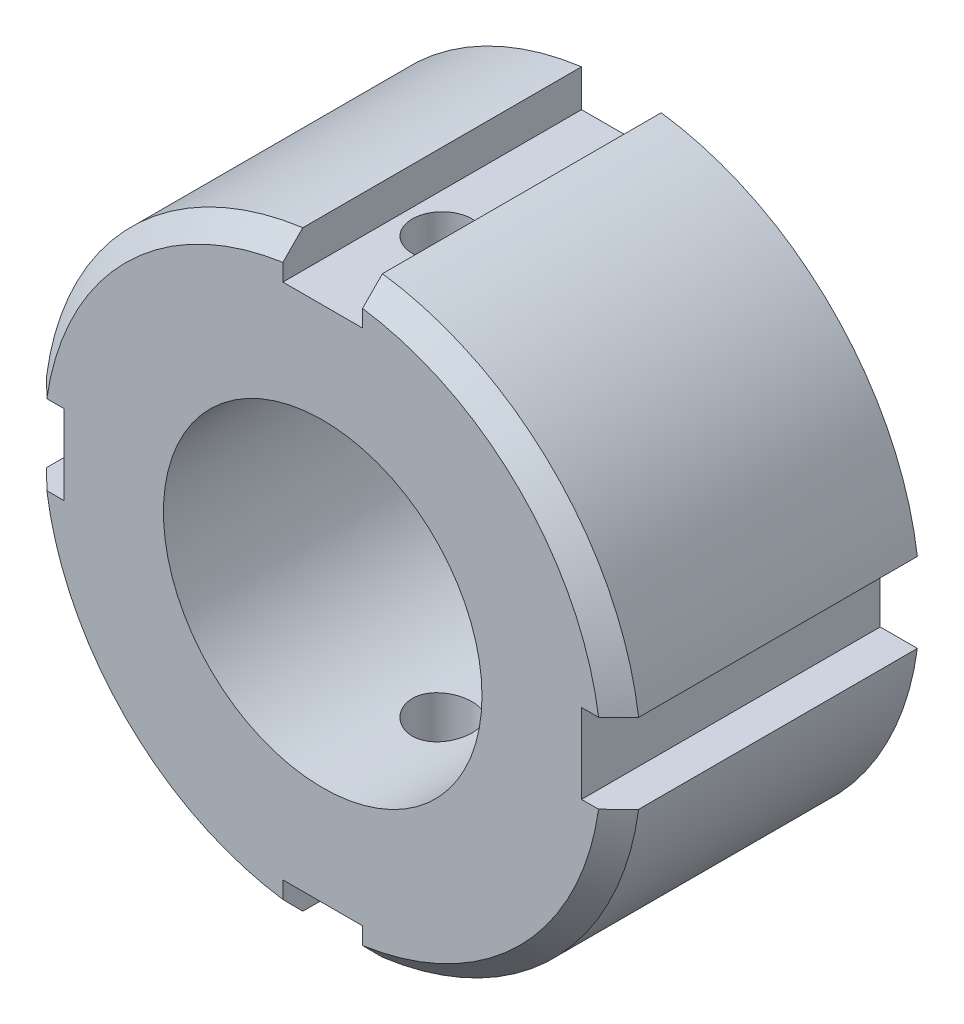
ISO-10303-21;
HEADER;
FILE_DESCRIPTION(('STEP AP214'),'2;1');
FILE_NAME('part.step','',(''),(''),'','','');
FILE_SCHEMA(('AUTOMOTIVE_DESIGN { 1 0 10303 214 1 1 1 1 }'));
ENDSEC;
DATA;
#1=APPLICATION_CONTEXT('core data for automotive mechanical design processes');
#2=APPLICATION_PROTOCOL_DEFINITION('international standard','automotive_design',2000,#1);
#3=PRODUCT_CONTEXT('',#1,'mechanical');
#4=PRODUCT('Part','Part','',(#3));
#5=PRODUCT_RELATED_PRODUCT_CATEGORY('part','',(#4));
#6=PRODUCT_DEFINITION_FORMATION('','',#4);
#7=PRODUCT_DEFINITION_CONTEXT('part definition',#1,'design');
#8=PRODUCT_DEFINITION('design','',#6,#7);
#9=PRODUCT_DEFINITION_SHAPE('','',#8);
#10=(LENGTH_UNIT() NAMED_UNIT(*) SI_UNIT(.MILLI.,.METRE.));
#11=(NAMED_UNIT(*) PLANE_ANGLE_UNIT() SI_UNIT($,.RADIAN.));
#12=(NAMED_UNIT(*) SI_UNIT($,.STERADIAN.) SOLID_ANGLE_UNIT());
#13=UNCERTAINTY_MEASURE_WITH_UNIT(LENGTH_MEASURE(1.E-05),#10,'distance_accuracy_value','');
#14=(GEOMETRIC_REPRESENTATION_CONTEXT(3) GLOBAL_UNCERTAINTY_ASSIGNED_CONTEXT((#13)) GLOBAL_UNIT_ASSIGNED_CONTEXT((#10,
#11,#12)) REPRESENTATION_CONTEXT('',''));
#15=CARTESIAN_POINT('',(0.,0.,0.));
#16=DIRECTION('',(0.,0.,1.));
#17=DIRECTION('',(1.,0.,0.));
#18=AXIS2_PLACEMENT_3D('',#15,#16,#17);
#19=CARTESIAN_POINT('',(0.,0.,7.5));
#20=DIRECTION('',(0.,0.,-1.));
#21=DIRECTION('',(-1.,0.,0.));
#22=AXIS2_PLACEMENT_3D('',#19,#20,#21);
#23=CYLINDRICAL_SURFACE('',#22,15.);
#24=DIRECTION('',(0.,0.,-1.));
#25=VECTOR('',#24,1.);
#26=CARTESIAN_POINT('',(2.,14.8660687473185,7.5));
#27=LINE('',#26,#25);
#28=CARTESIAN_POINT('',(2.,14.8660687473185,6.49999999999998));
#29=VERTEX_POINT('',#28);
#30=CARTESIAN_POINT('',(2.,14.8660687473185,-7.5));
#31=VERTEX_POINT('',#30);
#32=EDGE_CURVE('E217',#29,#31,#27,.T.);
#33=ORIENTED_EDGE('',*,*,#32,.F.);
#34=CARTESIAN_POINT('',(0.,0.,6.49999999999998));
#35=DIRECTION('',(0.,0.,1.));
#36=DIRECTION('',(1.,0.,0.));
#37=AXIS2_PLACEMENT_3D('',#34,#35,#36);
#38=CIRCLE('',#37,15.);
#39=CARTESIAN_POINT('',(14.8660687473185,1.99999999999995,6.49999999999998));
#40=VERTEX_POINT('',#39);
#41=EDGE_CURVE('E345',#29,#40,#38,.F.);
#42=ORIENTED_EDGE('',*,*,#41,.T.);
#43=DIRECTION('',(0.,0.,-1.));
#44=VECTOR('',#43,1.);
#45=CARTESIAN_POINT('',(14.8660687473185,1.99999999999995,7.5));
#46=LINE('',#45,#44);
#47=CARTESIAN_POINT('',(14.8660687473185,1.99999999999995,-7.5));
#48=VERTEX_POINT('',#47);
#49=EDGE_CURVE('E292',#40,#48,#46,.T.);
#50=ORIENTED_EDGE('',*,*,#49,.T.);
#51=CARTESIAN_POINT('',(0.,0.,-7.5));
#52=DIRECTION('',(0.,0.,1.));
#53=DIRECTION('',(1.,0.,0.));
#54=AXIS2_PLACEMENT_3D('',#51,#52,#53);
#55=CIRCLE('',#54,15.);
#56=EDGE_CURVE('E305',#48,#31,#55,.T.);
#57=ORIENTED_EDGE('',*,*,#56,.T.);
#58=EDGE_LOOP('',(#33,#42,#50,#57));
#59=FACE_BOUND('',#58,.T.);
#60=ADVANCED_FACE('F58',(#59),#23,.T.);
#61=DIRECTION('',(0.,0.,-1.));
#62=VECTOR('',#61,1.);
#63=CARTESIAN_POINT('',(-14.8660687473185,2.00000000000015,7.5));
#64=LINE('',#63,#62);
#65=CARTESIAN_POINT('',(-14.8660687473185,2.00000000000015,6.5));
#66=VERTEX_POINT('',#65);
#67=CARTESIAN_POINT('',(-14.8660687473185,2.00000000000015,-7.5));
#68=VERTEX_POINT('',#67);
#69=EDGE_CURVE('E256',#66,#68,#64,.T.);
#70=ORIENTED_EDGE('',*,*,#69,.F.);
#71=CARTESIAN_POINT('',(0.,0.,6.5));
#72=DIRECTION('',(0.,0.,1.));
#73=DIRECTION('',(1.,0.,0.));
#74=AXIS2_PLACEMENT_3D('',#71,#72,#73);
#75=CIRCLE('',#74,15.);
#76=CARTESIAN_POINT('',(-2.,14.8660687473185,6.49999999999999));
#77=VERTEX_POINT('',#76);
#78=EDGE_CURVE('E68',#66,#77,#75,.F.);
#79=ORIENTED_EDGE('',*,*,#78,.T.);
#80=DIRECTION('',(0.,0.,-1.));
#81=VECTOR('',#80,1.);
#82=CARTESIAN_POINT('',(-2.,14.8660687473185,7.5));
#83=LINE('',#82,#81);
#84=CARTESIAN_POINT('',(-2.,14.8660687473185,-7.5));
#85=VERTEX_POINT('',#84);
#86=EDGE_CURVE('E236',#77,#85,#83,.T.);
#87=ORIENTED_EDGE('',*,*,#86,.T.);
#88=EDGE_CURVE('E309',#85,#68,#55,.T.);
#89=ORIENTED_EDGE('',*,*,#88,.T.);
#90=EDGE_LOOP('',(#70,#79,#87,#89));
#91=FACE_BOUND('',#90,.T.);
#92=ADVANCED_FACE('F411',(#91),#23,.T.);
#93=CARTESIAN_POINT('',(0.,0.,7.5));
#94=DIRECTION('',(0.,0.,1.));
#95=DIRECTION('',(1.,0.,0.));
#96=AXIS2_PLACEMENT_3D('',#93,#94,#95);
#97=PLANE('',#96);
#98=DIRECTION('',(-1.,0.,0.));
#99=VECTOR('',#98,1.);
#100=CARTESIAN_POINT('',(0.,2.,7.5));
#101=LINE('',#100,#99);
#102=CARTESIAN_POINT('',(13.856406460551,1.99999999999995,7.5));
#103=VERTEX_POINT('',#102);
#104=CARTESIAN_POINT('',(13.,1.99999999999995,7.5));
#105=VERTEX_POINT('',#104);
#106=EDGE_CURVE('E285',#103,#105,#101,.T.);
#107=ORIENTED_EDGE('',*,*,#106,.F.);
#108=CARTESIAN_POINT('',(0.,0.,7.5));
#109=DIRECTION('',(0.,0.,1.));
#110=DIRECTION('',(1.,0.,0.));
#111=AXIS2_PLACEMENT_3D('',#108,#109,#110);
#112=CIRCLE('',#111,14.);
#113=CARTESIAN_POINT('',(2.,13.856406460551,7.5));
#114=VERTEX_POINT('',#113);
#115=EDGE_CURVE('E204',#103,#114,#112,.T.);
#116=ORIENTED_EDGE('',*,*,#115,.T.);
#117=DIRECTION('',(0.,-1.,0.));
#118=VECTOR('',#117,1.);
#119=CARTESIAN_POINT('',(2.,17.,7.5));
#120=LINE('',#119,#118);
#121=CARTESIAN_POINT('',(2.,13.,7.5));
#122=VERTEX_POINT('',#121);
#123=EDGE_CURVE('E196',#114,#122,#120,.T.);
#124=ORIENTED_EDGE('',*,*,#123,.T.);
#125=DIRECTION('',(1.,0.,0.));
#126=VECTOR('',#125,1.);
#127=CARTESIAN_POINT('',(-2.,13.,7.5));
#128=LINE('',#127,#126);
#129=CARTESIAN_POINT('',(-2.,13.,7.5));
#130=VERTEX_POINT('',#129);
#131=EDGE_CURVE('E202',#130,#122,#128,.T.);
#132=ORIENTED_EDGE('',*,*,#131,.F.);
#133=DIRECTION('',(0.,-1.,0.));
#134=VECTOR('',#133,1.);
#135=CARTESIAN_POINT('',(-2.,0.,7.5));
#136=LINE('',#135,#134);
#137=CARTESIAN_POINT('',(-2.,13.856406460551,7.5));
#138=VERTEX_POINT('',#137);
#139=EDGE_CURVE('E222',#138,#130,#136,.T.);
#140=ORIENTED_EDGE('',*,*,#139,.F.);
#141=CARTESIAN_POINT('',(0.,0.,7.5));
#142=DIRECTION('',(0.,0.,1.));
#143=DIRECTION('',(1.,0.,0.));
#144=AXIS2_PLACEMENT_3D('',#141,#142,#143);
#145=CIRCLE('',#144,14.);
#146=CARTESIAN_POINT('',(-13.856406460551,2.00000000000014,7.5));
#147=VERTEX_POINT('',#146);
#148=EDGE_CURVE('E328',#138,#147,#145,.T.);
#149=ORIENTED_EDGE('',*,*,#148,.T.);
#150=DIRECTION('',(1.,0.,0.));
#151=VECTOR('',#150,1.);
#152=CARTESIAN_POINT('',(0.,2.,7.5));
#153=LINE('',#152,#151);
#154=CARTESIAN_POINT('',(-13.,2.00000000000014,7.5));
#155=VERTEX_POINT('',#154);
#156=EDGE_CURVE('E250',#147,#155,#153,.T.);
#157=ORIENTED_EDGE('',*,*,#156,.T.);
#158=DIRECTION('',(0.,1.,0.));
#159=VECTOR('',#158,1.);
#160=CARTESIAN_POINT('',(-13.,1.35308431126191E-13,7.5));
#161=LINE('',#160,#159);
#162=CARTESIAN_POINT('',(-13.,-1.99999999999987,7.5));
#163=VERTEX_POINT('',#162);
#164=EDGE_CURVE('E245',#163,#155,#161,.T.);
#165=ORIENTED_EDGE('',*,*,#164,.F.);
#166=DIRECTION('',(1.,0.,0.));
#167=VECTOR('',#166,1.);
#168=CARTESIAN_POINT('',(0.,-2.,7.5));
#169=LINE('',#168,#167);
#170=CARTESIAN_POINT('',(-13.856406460551,-1.99999999999986,7.5));
#171=VERTEX_POINT('',#170);
#172=EDGE_CURVE('E248',#171,#163,#169,.T.);
#173=ORIENTED_EDGE('',*,*,#172,.F.);
#174=CARTESIAN_POINT('',(0.,0.,7.5));
#175=DIRECTION('',(0.,0.,1.));
#176=DIRECTION('',(1.,0.,0.));
#177=AXIS2_PLACEMENT_3D('',#174,#175,#176);
#178=CIRCLE('',#177,14.);
#179=CARTESIAN_POINT('',(-2.0000000000001,-13.856406460551,7.5));
#180=VERTEX_POINT('',#179);
#181=EDGE_CURVE('E331',#171,#180,#178,.T.);
#182=ORIENTED_EDGE('',*,*,#181,.T.);
#183=DIRECTION('',(0.,1.,0.));
#184=VECTOR('',#183,1.);
#185=CARTESIAN_POINT('',(-2.,0.,7.5));
#186=LINE('',#185,#184);
#187=CARTESIAN_POINT('',(-2.00000000000009,-13.,7.5));
#188=VERTEX_POINT('',#187);
#189=EDGE_CURVE('E270',#180,#188,#186,.T.);
#190=ORIENTED_EDGE('',*,*,#189,.T.);
#191=DIRECTION('',(-1.,0.,0.));
#192=VECTOR('',#191,1.);
#193=CARTESIAN_POINT('',(0.,-13.,7.5));
#194=LINE('',#193,#192);
#195=CARTESIAN_POINT('',(1.99999999999991,-13.,7.5));
#196=VERTEX_POINT('',#195);
#197=EDGE_CURVE('E265',#196,#188,#194,.T.);
#198=ORIENTED_EDGE('',*,*,#197,.F.);
#199=DIRECTION('',(0.,1.,0.));
#200=VECTOR('',#199,1.);
#201=CARTESIAN_POINT('',(2.,0.,7.5));
#202=LINE('',#201,#200);
#203=CARTESIAN_POINT('',(1.9999999999999,-13.856406460551,7.5));
#204=VERTEX_POINT('',#203);
#205=EDGE_CURVE('E268',#204,#196,#202,.T.);
#206=ORIENTED_EDGE('',*,*,#205,.F.);
#207=CARTESIAN_POINT('',(0.,0.,7.5));
#208=DIRECTION('',(0.,0.,1.));
#209=DIRECTION('',(1.,0.,0.));
#210=AXIS2_PLACEMENT_3D('',#207,#208,#209);
#211=CIRCLE('',#210,14.);
#212=CARTESIAN_POINT('',(13.856406460551,-2.00000000000005,7.5));
#213=VERTEX_POINT('',#212);
#214=EDGE_CURVE('E334',#204,#213,#211,.T.);
#215=ORIENTED_EDGE('',*,*,#214,.T.);
#216=DIRECTION('',(-1.,0.,0.));
#217=VECTOR('',#216,1.);
#218=CARTESIAN_POINT('',(0.,-2.,7.5));
#219=LINE('',#218,#217);
#220=CARTESIAN_POINT('',(13.,-2.00000000000005,7.5));
#221=VERTEX_POINT('',#220);
#222=EDGE_CURVE('E278',#213,#221,#219,.T.);
#223=ORIENTED_EDGE('',*,*,#222,.T.);
#224=DIRECTION('',(0.,-1.,0.));
#225=VECTOR('',#224,1.);
#226=CARTESIAN_POINT('',(13.,0.,7.5));
#227=LINE('',#226,#225);
#228=EDGE_CURVE('E283',#105,#221,#227,.T.);
#229=ORIENTED_EDGE('',*,*,#228,.F.);
#230=EDGE_LOOP('',(#107,#116,#124,#132,#140,#149,#157,#165,#173,#182,#190,#198,#206,#215,#223,#229));
#231=FACE_BOUND('',#230,.T.);
#232=CARTESIAN_POINT('',(0.,0.,7.5));
#233=DIRECTION('',(0.,0.,1.));
#234=DIRECTION('',(1.,0.,0.));
#235=AXIS2_PLACEMENT_3D('',#232,#233,#234);
#236=CIRCLE('',#235,8.);
#237=CARTESIAN_POINT('',(8.,0.,7.5));
#238=VERTEX_POINT('',#237);
#239=EDGE_CURVE('E298',#238,#238,#236,.T.);
#240=ORIENTED_EDGE('',*,*,#239,.F.);
#241=EDGE_LOOP('',(#240));
#242=FACE_BOUND('',#241,.T.);
#243=ADVANCED_FACE('F199',(#231,#242),#97,.T.);
#244=CARTESIAN_POINT('',(0.,0.,-7.5));
#245=DIRECTION('',(0.,0.,1.));
#246=DIRECTION('',(1.,0.,0.));
#247=AXIS2_PLACEMENT_3D('',#244,#245,#246);
#248=PLANE('',#247);
#249=CARTESIAN_POINT('',(0.,0.,-7.5));
#250=DIRECTION('',(0.,0.,1.));
#251=DIRECTION('',(1.,0.,0.));
#252=AXIS2_PLACEMENT_3D('',#249,#250,#251);
#253=CIRCLE('',#252,8.);
#254=CARTESIAN_POINT('',(8.,0.,-7.5));
#255=VERTEX_POINT('',#254);
#256=EDGE_CURVE('E299',#255,#255,#253,.T.);
#257=ORIENTED_EDGE('',*,*,#256,.T.);
#258=EDGE_LOOP('',(#257));
#259=FACE_BOUND('',#258,.T.);
#260=ORIENTED_EDGE('',*,*,#88,.F.);
#261=DIRECTION('',(0.,-1.,0.));
#262=VECTOR('',#261,1.);
#263=CARTESIAN_POINT('',(-2.,0.,-7.5));
#264=LINE('',#263,#262);
#265=CARTESIAN_POINT('',(-2.,13.,-7.5));
#266=VERTEX_POINT('',#265);
#267=EDGE_CURVE('E325',#85,#266,#264,.T.);
#268=ORIENTED_EDGE('',*,*,#267,.T.);
#269=DIRECTION('',(1.,0.,0.));
#270=VECTOR('',#269,1.);
#271=CARTESIAN_POINT('',(-2.,13.,-7.5));
#272=LINE('',#271,#270);
#273=CARTESIAN_POINT('',(2.,13.,-7.5));
#274=VERTEX_POINT('',#273);
#275=EDGE_CURVE('E207',#266,#274,#272,.T.);
#276=ORIENTED_EDGE('',*,*,#275,.T.);
#277=DIRECTION('',(0.,-1.,0.));
#278=VECTOR('',#277,1.);
#279=CARTESIAN_POINT('',(2.,0.,-7.5));
#280=LINE('',#279,#278);
#281=EDGE_CURVE('E221',#31,#274,#280,.T.);
#282=ORIENTED_EDGE('',*,*,#281,.F.);
#283=ORIENTED_EDGE('',*,*,#56,.F.);
#284=DIRECTION('',(-1.,0.,0.));
#285=VECTOR('',#284,1.);
#286=CARTESIAN_POINT('',(0.,2.,-7.5));
#287=LINE('',#286,#285);
#288=CARTESIAN_POINT('',(13.,1.99999999999995,-7.5));
#289=VERTEX_POINT('',#288);
#290=EDGE_CURVE('E308',#48,#289,#287,.T.);
#291=ORIENTED_EDGE('',*,*,#290,.T.);
#292=DIRECTION('',(0.,-1.,0.));
#293=VECTOR('',#292,1.);
#294=CARTESIAN_POINT('',(13.,0.,-7.5));
#295=LINE('',#294,#293);
#296=CARTESIAN_POINT('',(13.,-2.00000000000005,-7.5));
#297=VERTEX_POINT('',#296);
#298=EDGE_CURVE('E279',#289,#297,#295,.T.);
#299=ORIENTED_EDGE('',*,*,#298,.T.);
#300=DIRECTION('',(-1.,0.,0.));
#301=VECTOR('',#300,1.);
#302=CARTESIAN_POINT('',(0.,-2.,-7.5));
#303=LINE('',#302,#301);
#304=CARTESIAN_POINT('',(14.8660687473185,-2.00000000000005,-7.5));
#305=VERTEX_POINT('',#304);
#306=EDGE_CURVE('E312',#305,#297,#303,.T.);
#307=ORIENTED_EDGE('',*,*,#306,.F.);
#308=CARTESIAN_POINT('',(1.9999999999999,-14.8660687473185,-7.5));
#309=VERTEX_POINT('',#308);
#310=EDGE_CURVE('E302',#309,#305,#55,.T.);
#311=ORIENTED_EDGE('',*,*,#310,.F.);
#312=DIRECTION('',(0.,1.,0.));
#313=VECTOR('',#312,1.);
#314=CARTESIAN_POINT('',(2.,0.,-7.5));
#315=LINE('',#314,#313);
#316=CARTESIAN_POINT('',(1.99999999999991,-13.,-7.5));
#317=VERTEX_POINT('',#316);
#318=EDGE_CURVE('E314',#309,#317,#315,.T.);
#319=ORIENTED_EDGE('',*,*,#318,.T.);
#320=DIRECTION('',(-1.,0.,0.));
#321=VECTOR('',#320,1.);
#322=CARTESIAN_POINT('',(0.,-13.,-7.5));
#323=LINE('',#322,#321);
#324=CARTESIAN_POINT('',(-2.00000000000009,-13.,-7.5));
#325=VERTEX_POINT('',#324);
#326=EDGE_CURVE('E262',#317,#325,#323,.T.);
#327=ORIENTED_EDGE('',*,*,#326,.T.);
#328=DIRECTION('',(0.,1.,0.));
#329=VECTOR('',#328,1.);
#330=CARTESIAN_POINT('',(-2.,0.,-7.5));
#331=LINE('',#330,#329);
#332=CARTESIAN_POINT('',(-2.00000000000011,-14.8660687473185,-7.5));
#333=VERTEX_POINT('',#332);
#334=EDGE_CURVE('E317',#333,#325,#331,.T.);
#335=ORIENTED_EDGE('',*,*,#334,.F.);
#336=CARTESIAN_POINT('',(-14.8660687473185,-1.99999999999985,-7.5));
#337=VERTEX_POINT('',#336);
#338=EDGE_CURVE('E483',#337,#333,#55,.T.);
#339=ORIENTED_EDGE('',*,*,#338,.F.);
#340=DIRECTION('',(1.,0.,0.));
#341=VECTOR('',#340,1.);
#342=CARTESIAN_POINT('',(0.,-2.,-7.5));
#343=LINE('',#342,#341);
#344=CARTESIAN_POINT('',(-13.,-1.99999999999987,-7.5));
#345=VERTEX_POINT('',#344);
#346=EDGE_CURVE('E319',#337,#345,#343,.T.);
#347=ORIENTED_EDGE('',*,*,#346,.T.);
#348=DIRECTION('',(0.,1.,0.));
#349=VECTOR('',#348,1.);
#350=CARTESIAN_POINT('',(-13.,1.35308431126191E-13,-7.5));
#351=LINE('',#350,#349);
#352=CARTESIAN_POINT('',(-13.,2.00000000000014,-7.5));
#353=VERTEX_POINT('',#352);
#354=EDGE_CURVE('E242',#345,#353,#351,.T.);
#355=ORIENTED_EDGE('',*,*,#354,.T.);
#356=DIRECTION('',(1.,0.,0.));
#357=VECTOR('',#356,1.);
#358=CARTESIAN_POINT('',(0.,2.,-7.5));
#359=LINE('',#358,#357);
#360=EDGE_CURVE('E322',#68,#353,#359,.T.);
#361=ORIENTED_EDGE('',*,*,#360,.F.);
#362=EDGE_LOOP('',(#260,#268,#276,#282,#283,#291,#299,#307,#311,#319,#327,#335,#339,#347,#355,#361));
#363=FACE_BOUND('',#362,.T.);
#364=ADVANCED_FACE('F424',(#259,#363),#248,.F.);
#365=DIRECTION('',(0.,0.,-1.));
#366=VECTOR('',#365,1.);
#367=CARTESIAN_POINT('',(-2.00000000000011,-14.8660687473185,7.5));
#368=LINE('',#367,#366);
#369=CARTESIAN_POINT('',(-2.00000000000011,-14.8660687473185,6.5));
#370=VERTEX_POINT('',#369);
#371=EDGE_CURVE('E276',#370,#333,#368,.T.);
#372=ORIENTED_EDGE('',*,*,#371,.F.);
#373=CARTESIAN_POINT('',(0.,0.,6.5));
#374=DIRECTION('',(0.,0.,1.));
#375=DIRECTION('',(1.,0.,0.));
#376=AXIS2_PLACEMENT_3D('',#373,#374,#375);
#377=CIRCLE('',#376,15.);
#378=CARTESIAN_POINT('',(-14.8660687473185,-1.99999999999985,6.5));
#379=VERTEX_POINT('',#378);
#380=EDGE_CURVE('E498',#370,#379,#377,.F.);
#381=ORIENTED_EDGE('',*,*,#380,.T.);
#382=DIRECTION('',(0.,0.,-1.));
#383=VECTOR('',#382,1.);
#384=CARTESIAN_POINT('',(-14.8660687473185,-1.99999999999985,7.5));
#385=LINE('',#384,#383);
#386=EDGE_CURVE('E252',#379,#337,#385,.T.);
#387=ORIENTED_EDGE('',*,*,#386,.T.);
#388=ORIENTED_EDGE('',*,*,#338,.T.);
#389=EDGE_LOOP('',(#372,#381,#387,#388));
#390=FACE_BOUND('',#389,.T.);
#391=ADVANCED_FACE('F416',(#390),#23,.T.);
#392=DIRECTION('',(0.,0.,-1.));
#393=VECTOR('',#392,1.);
#394=CARTESIAN_POINT('',(14.8660687473185,-2.00000000000005,7.5));
#395=LINE('',#394,#393);
#396=CARTESIAN_POINT('',(14.8660687473185,-2.00000000000005,6.5));
#397=VERTEX_POINT('',#396);
#398=EDGE_CURVE('E296',#397,#305,#395,.T.);
#399=ORIENTED_EDGE('',*,*,#398,.F.);
#400=CARTESIAN_POINT('',(0.,0.,6.5));
#401=DIRECTION('',(0.,0.,1.));
#402=DIRECTION('',(1.,0.,0.));
#403=AXIS2_PLACEMENT_3D('',#400,#401,#402);
#404=CIRCLE('',#403,15.);
#405=CARTESIAN_POINT('',(1.9999999999999,-14.8660687473185,6.5));
#406=VERTEX_POINT('',#405);
#407=EDGE_CURVE('E429',#397,#406,#404,.F.);
#408=ORIENTED_EDGE('',*,*,#407,.T.);
#409=DIRECTION('',(0.,0.,-1.));
#410=VECTOR('',#409,1.);
#411=CARTESIAN_POINT('',(1.9999999999999,-14.8660687473185,7.5));
#412=LINE('',#411,#410);
#413=EDGE_CURVE('E272',#406,#309,#412,.T.);
#414=ORIENTED_EDGE('',*,*,#413,.T.);
#415=ORIENTED_EDGE('',*,*,#310,.T.);
#416=EDGE_LOOP('',(#399,#408,#414,#415));
#417=FACE_BOUND('',#416,.T.);
#418=ADVANCED_FACE('F356',(#417),#23,.T.);
#419=CARTESIAN_POINT('',(0.,0.,-7.5));
#420=DIRECTION('',(0.,0.,1.));
#421=DIRECTION('',(1.,0.,0.));
#422=AXIS2_PLACEMENT_3D('',#419,#420,#421);
#423=CYLINDRICAL_SURFACE('',#422,8.);
#424=CARTESIAN_POINT('',(1.50000000000006,7.85811682275085,1.5));
#425=CARTESIAN_POINT('',(1.49999679883251,7.85811843793492,1.41654279198826));
#426=CARTESIAN_POINT('',(1.49301126348941,7.85946079760265,1.33304405178161));
#427=CARTESIAN_POINT('',(1.46527253251811,7.86467851014363,1.16840103841809));
#428=CARTESIAN_POINT('',(1.44450765768482,7.86855601173204,1.08725882357252));
#429=CARTESIAN_POINT('',(1.38987035617793,7.87838976464884,0.929734928629124));
#430=CARTESIAN_POINT('',(1.3560101395438,7.88434407905996,0.853348890692711));
#431=CARTESIAN_POINT('',(1.27617565760371,7.89765826320958,0.707346440713187));
#432=CARTESIAN_POINT('',(1.23020233759199,7.90501802325621,0.637729500996698));
#433=CARTESIAN_POINT('',(1.12683678942628,7.92041614838944,0.506369800800867));
#434=CARTESIAN_POINT('',(1.06932292933097,7.92846116625678,0.444723516528269));
#435=CARTESIAN_POINT('',(0.944771778803607,7.94426457664033,0.331895610400436));
#436=CARTESIAN_POINT('',(0.877733863625,7.95202295031152,0.280714675575205));
#437=CARTESIAN_POINT('',(0.735403894570218,7.96645017828404,0.189900623399484));
#438=CARTESIAN_POINT('',(0.660052840033921,7.97311028052362,0.150358466480578));
#439=CARTESIAN_POINT('',(0.503631283250818,7.9845160863293,0.0845304577264669));
#440=CARTESIAN_POINT('',(0.422561251859562,7.98926194728334,0.0582435160097801));
#441=CARTESIAN_POINT('',(0.258002746187472,7.99625755123778,0.0199704513888662));
#442=CARTESIAN_POINT('',(0.174553323244913,7.99853565976327,0.00782169407731461));
#443=CARTESIAN_POINT('',(0.00677167603543945,8.00043684615594,-0.00233688770040133));
#444=CARTESIAN_POINT('',(-0.0775604724476139,8.00006015010697,-0.000347916139057801));
#445=CARTESIAN_POINT('',(-0.24359835789934,7.99671633763241,0.0175877711471509));
#446=CARTESIAN_POINT('',(-0.325323760451413,7.99378172247214,0.0333593694300106));
#447=CARTESIAN_POINT('',(-0.484947165715419,7.98568826333562,0.0781356493952366));
#448=CARTESIAN_POINT('',(-0.562845028826484,7.98052933829966,0.107140813345804));
#449=CARTESIAN_POINT('',(-0.713110065751465,7.9685126029734,0.1777277310583));
#450=CARTESIAN_POINT('',(-0.785443571838477,7.96164537590826,0.219379487912497));
#451=CARTESIAN_POINT('',(-0.922159977214582,7.94697147542851,0.314025669077153));
#452=CARTESIAN_POINT('',(-0.986542066910729,7.93916470651165,0.367021246887581));
#453=CARTESIAN_POINT('',(-1.10656561896898,7.92333513680567,0.483815702983531));
#454=CARTESIAN_POINT('',(-1.16205790757036,7.91531085901622,0.547767783902073));
#455=CARTESIAN_POINT('',(-1.26155171851255,7.90006508924621,0.684149531278624));
#456=CARTESIAN_POINT('',(-1.30555307271177,7.89284360901352,0.756579321764634));
#457=CARTESIAN_POINT('',(-1.38085852224472,7.88001893307122,0.90805827070266));
#458=CARTESIAN_POINT('',(-1.41214093645416,7.87441850530262,0.987118457190644));
#459=CARTESIAN_POINT('',(-1.46093656975051,7.8655124239669,1.1495011841232));
#460=CARTESIAN_POINT('',(-1.47845134901103,7.86220651038621,1.23282324046478));
#461=CARTESIAN_POINT('',(-1.49899672649734,7.85831520301006,1.40001932885588));
#462=CARTESIAN_POINT('',(-1.50224164285853,7.85768955816138,1.48386611556551));
#463=CARTESIAN_POINT('',(-1.49472968881719,7.85912191420841,1.65090345508715));
#464=CARTESIAN_POINT('',(-1.48397351086428,7.86117978238612,1.73409404014808));
#465=CARTESIAN_POINT('',(-1.44894868195877,7.86770980063206,1.89675290305439));
#466=CARTESIAN_POINT('',(-1.42479238583984,7.87216186690879,1.97624625262489));
#467=CARTESIAN_POINT('',(-1.36377224379054,7.88296134156619,2.13005718973016));
#468=CARTESIAN_POINT('',(-1.32690746128789,7.88930888963282,2.20437439531533));
#469=CARTESIAN_POINT('',(-1.24102353119654,7.90327577863686,2.34666761904317));
#470=CARTESIAN_POINT('',(-1.19186899639615,7.91090895425316,2.41456053786607));
#471=CARTESIAN_POINT('',(-1.08298344344241,7.92654811368101,2.54121204021433));
#472=CARTESIAN_POINT('',(-1.02325147433078,7.93455413096494,2.59996980155577));
#473=CARTESIAN_POINT('',(-0.893949417870329,7.95016624005946,2.70748376353413));
#474=CARTESIAN_POINT('',(-0.824258534095834,7.95776555833306,2.75609582660597));
#475=CARTESIAN_POINT('',(-0.677574523040084,7.97159404810351,2.84092120617766));
#476=CARTESIAN_POINT('',(-0.600581677038472,7.97782327234725,2.87713500002501));
#477=CARTESIAN_POINT('',(-0.441877541578628,7.98818057995848,2.93592009786408));
#478=CARTESIAN_POINT('',(-0.360193213078931,7.99231954730142,2.95856218756141));
#479=CARTESIAN_POINT('',(-0.194096227381514,7.99807642083745,2.98978704828989));
#480=CARTESIAN_POINT('',(-0.109683858215794,7.99969459229933,2.99837129866271));
#481=CARTESIAN_POINT('',(0.0580907602505658,8.00022227515441,3.00118530151844));
#482=CARTESIAN_POINT('',(0.141449307066325,7.99917286625032,2.99563275312953));
#483=CARTESIAN_POINT('',(0.306023369279256,7.99456866611702,2.97080757223156));
#484=CARTESIAN_POINT('',(0.387238905213746,7.99101389890671,2.95153507125579));
#485=CARTESIAN_POINT('',(0.545106475595541,7.98179837978045,2.89990879261628));
#486=CARTESIAN_POINT('',(0.62176631931828,7.97614135981575,2.86757818711899));
#487=CARTESIAN_POINT('',(0.76860563131675,7.9633337206877,2.79077954634482));
#488=CARTESIAN_POINT('',(0.838784665003327,7.95618300146482,2.74631069789335));
#489=CARTESIAN_POINT('',(0.971755027780063,7.9410477985994,2.64574854555768));
#490=CARTESIAN_POINT('',(1.03442623539059,7.93305284591271,2.58949796613829));
#491=CARTESIAN_POINT('',(1.14951536065491,7.91719633538832,2.46729543750729));
#492=CARTESIAN_POINT('',(1.20193086324786,7.90933480936764,2.40134120962628));
#493=CARTESIAN_POINT('',(1.2954763394539,7.89455577425925,2.26087354529666));
#494=CARTESIAN_POINT('',(1.33649740531877,7.88764767280728,2.18628656033236));
#495=CARTESIAN_POINT('',(1.40536132423422,7.87567084650032,2.03117421002026));
#496=CARTESIAN_POINT('',(1.43321661638918,7.87060038649115,1.95065453341062));
#497=CARTESIAN_POINT('',(1.46929726596181,7.86393016292124,1.80824771193409));
#498=CARTESIAN_POINT('',(1.48079105739856,7.86176310717931,1.74719427623805));
#499=CARTESIAN_POINT('',(1.4961435107622,7.85885585595503,1.62410153157968));
#500=CARTESIAN_POINT('',(1.50000238052133,7.85811562163282,1.56206224949967));
#501=CARTESIAN_POINT('',(1.50000000000006,7.85811682275085,1.5));
#502=B_SPLINE_CURVE_WITH_KNOTS('',3,(#424,#425,#426,#427,#428,#429,#430,#431,#432,#433,#434,
#435,#436,#437,#438,#439,#440,#441,#442,#443,#444,#445,#446,#447,#448,#449,#450,#451,#452,#453,
#454,#455,#456,#457,#458,#459,#460,#461,#462,#463,#464,#465,#466,#467,#468,#469,#470,#471,#472,
#473,#474,#475,#476,#477,#478,#479,#480,#481,#482,#483,#484,#485,#486,#487,#488,#489,#490,#491,
#492,#493,#494,#495,#496,#497,#498,#499,#500,#501),.UNSPECIFIED.,.T.,.F.,(4,2,2,2,2,2,2,2,2,2,2,
2,2,2,2,2,2,2,2,2,2,2,2,2,2,2,2,2,2,2,2,2,2,2,2,2,2,2,4),(0.,0.250144505793187,
0.500501302380393,0.750625227978433,1.00072963993908,1.25362335698691,1.50653367069315,
1.76137104348047,2.0161874593964,2.26804275460261,2.51987660200648,2.76855650598725,
3.01724547328425,3.26733691984219,3.51745380911785,3.77140614764064,4.025362201924,
4.27974936118266,4.53410768866488,4.78463248587075,5.03514489338718,5.28358792315368,
5.53204926624317,5.78337862654144,6.03473059394677,6.28944125495871,6.54414210821705,
6.79750269418683,7.0508366166733,7.30029300570138,7.54974700322167,7.79876026530358,
8.0477902135711,8.30038464008745,8.55303847730765,8.80803001818118,9.06278015749119,
9.24880307527214,9.43482092920425),.UNSPECIFIED.);
#503=CARTESIAN_POINT('',(1.50000000000006,7.85811682275085,1.5));
#504=VERTEX_POINT('',#503);
#505=EDGE_CURVE('E227',#504,#504,#502,.T.);
#506=ORIENTED_EDGE('',*,*,#505,.T.);
#507=EDGE_LOOP('',(#506));
#508=FACE_BOUND('',#507,.T.);
#509=CARTESIAN_POINT('',(1.49999999999995,-7.85811682275087,1.5));
#510=CARTESIAN_POINT('',(1.4999967988324,-7.85811843793494,1.58345720801174));
#511=CARTESIAN_POINT('',(1.4930112634893,-7.85946079760267,1.66695594821839));
#512=CARTESIAN_POINT('',(1.465272532518,-7.86467851014365,1.83159896158191));
#513=CARTESIAN_POINT('',(1.44450765768471,-7.86855601173206,1.91274117642748));
#514=CARTESIAN_POINT('',(1.38987035617782,-7.87838976464885,2.07026507137088));
#515=CARTESIAN_POINT('',(1.35601013954369,-7.88434407905998,2.14665110930729));
#516=CARTESIAN_POINT('',(1.2761756576036,-7.8976582632096,2.29265355928681));
#517=CARTESIAN_POINT('',(1.23020233759188,-7.90501802325622,2.3622704990033));
#518=CARTESIAN_POINT('',(1.12683678942617,-7.92041614838945,2.49363019919913));
#519=CARTESIAN_POINT('',(1.06932292933086,-7.9284611662568,2.55527648347173));
#520=CARTESIAN_POINT('',(0.944771778803496,-7.94426457664034,2.66810438959956));
#521=CARTESIAN_POINT('',(0.877733863624889,-7.95202295031153,2.71928532442479));
#522=CARTESIAN_POINT('',(0.735403894570107,-7.96645017828405,2.81009937660052));
#523=CARTESIAN_POINT('',(0.66005284003381,-7.97311028052363,2.84964153351942));
#524=CARTESIAN_POINT('',(0.503631283250707,-7.98451608632931,2.91546954227353));
#525=CARTESIAN_POINT('',(0.422561251859451,-7.98926194728334,2.94175648399022));
#526=CARTESIAN_POINT('',(0.258002746187361,-7.99625755123778,2.98002954861113));
#527=CARTESIAN_POINT('',(0.174553323244802,-7.99853565976327,2.99217830592268));
#528=CARTESIAN_POINT('',(0.00677167603532796,-8.00043684615594,3.0023368877004));
#529=CARTESIAN_POINT('',(-0.0775604724477253,-8.00006015010697,3.00034791613906));
#530=CARTESIAN_POINT('',(-0.243598357899452,-7.99671633763241,2.98241222885285));
#531=CARTESIAN_POINT('',(-0.325323760451524,-7.99378172247214,2.96664063056999));
#532=CARTESIAN_POINT('',(-0.48494716571553,-7.98568826333561,2.92186435060476));
#533=CARTESIAN_POINT('',(-0.562845028826595,-7.98052933829965,2.89285918665419));
#534=CARTESIAN_POINT('',(-0.713110065751576,-7.96851260297339,2.8222722689417));
#535=CARTESIAN_POINT('',(-0.785443571838588,-7.96164537590825,2.7806205120875));
#536=CARTESIAN_POINT('',(-0.922159977214693,-7.94697147542849,2.68597433092285));
#537=CARTESIAN_POINT('',(-0.98654206691084,-7.93916470651163,2.63297875311242));
#538=CARTESIAN_POINT('',(-1.10656561896909,-7.92333513680566,2.51618429701647));
#539=CARTESIAN_POINT('',(-1.16205790757047,-7.91531085901621,2.45223221609793));
#540=CARTESIAN_POINT('',(-1.26155171851266,-7.9000650892462,2.31585046872137));
#541=CARTESIAN_POINT('',(-1.30555307271188,-7.8928436090135,2.24342067823536));
#542=CARTESIAN_POINT('',(-1.38085852224483,-7.8800189330712,2.09194172929734));
#543=CARTESIAN_POINT('',(-1.41214093645427,-7.8744185053026,2.01288154280935));
#544=CARTESIAN_POINT('',(-1.46093656975061,-7.86551242396688,1.8504988158768));
#545=CARTESIAN_POINT('',(-1.47845134901113,-7.86220651038619,1.76717675953521));
#546=CARTESIAN_POINT('',(-1.49899672649744,-7.85831520301004,1.59998067114412));
#547=CARTESIAN_POINT('',(-1.50224164285864,-7.85768955816136,1.51613388443448));
#548=CARTESIAN_POINT('',(-1.4947296888173,-7.85912191420839,1.34909654491285));
#549=CARTESIAN_POINT('',(-1.48397351086438,-7.8611797823861,1.26590595985192));
#550=CARTESIAN_POINT('',(-1.44894868195888,-7.86770980063204,1.10324709694561));
#551=CARTESIAN_POINT('',(-1.42479238583995,-7.87216186690877,1.0237537473751));
#552=CARTESIAN_POINT('',(-1.36377224379065,-7.88296134156618,0.869942810269841));
#553=CARTESIAN_POINT('',(-1.326907461288,-7.8893088896328,0.795625604684668));
#554=CARTESIAN_POINT('',(-1.24102353119665,-7.90327577863684,0.65333238095683));
#555=CARTESIAN_POINT('',(-1.19186899639626,-7.91090895425314,0.585439462133926));
#556=CARTESIAN_POINT('',(-1.08298344344252,-7.926548113681,0.458787959785666));
#557=CARTESIAN_POINT('',(-1.02325147433089,-7.93455413096493,0.400030198444225));
#558=CARTESIAN_POINT('',(-0.893949417870439,-7.95016624005945,0.292516236465873));
#559=CARTESIAN_POINT('',(-0.824258534095944,-7.95776555833304,0.243904173394033));
#560=CARTESIAN_POINT('',(-0.677574523040194,-7.9715940481035,0.159078793822335));
#561=CARTESIAN_POINT('',(-0.600581677038582,-7.97782327234724,0.122864999974994));
#562=CARTESIAN_POINT('',(-0.441877541578738,-7.98818057995847,0.0640799021359183));
#563=CARTESIAN_POINT('',(-0.360193213079041,-7.99231954730142,0.0414378124385894));
#564=CARTESIAN_POINT('',(-0.194096227381624,-7.99807642083745,0.0102129517101131));
#565=CARTESIAN_POINT('',(-0.109683858215905,-7.99969459229933,0.00162870133728976));
#566=CARTESIAN_POINT('',(0.0580907602504556,-8.00022227515441,-0.00118530151844236));
#567=CARTESIAN_POINT('',(0.141449307066215,-7.99917286625032,0.00436724687047229));
#568=CARTESIAN_POINT('',(0.306023369279146,-7.99456866611703,0.0291924277684349));
#569=CARTESIAN_POINT('',(0.387238905213636,-7.99101389890672,0.0484649287442101));
#570=CARTESIAN_POINT('',(0.545106475595431,-7.98179837978045,0.100091207383717));
#571=CARTESIAN_POINT('',(0.62176631931817,-7.97614135981576,0.132421812881007));
#572=CARTESIAN_POINT('',(0.768605631316641,-7.96333372068771,0.209220453655182));
#573=CARTESIAN_POINT('',(0.838784665003217,-7.95618300146484,0.253689302106654));
#574=CARTESIAN_POINT('',(0.971755027779953,-7.94104779859942,0.354251454442321));
#575=CARTESIAN_POINT('',(1.03442623539048,-7.93305284591272,0.410502033861706));
#576=CARTESIAN_POINT('',(1.1495153606548,-7.91719633538834,0.532704562492707));
#577=CARTESIAN_POINT('',(1.20193086324775,-7.90933480936765,0.59865879037372));
#578=CARTESIAN_POINT('',(1.29547633945379,-7.89455577425927,0.739126454703346));
#579=CARTESIAN_POINT('',(1.33649740531866,-7.8876476728073,0.813713439667639));
#580=CARTESIAN_POINT('',(1.40536132423411,-7.87567084650034,0.968825789979742));
#581=CARTESIAN_POINT('',(1.43321661638907,-7.87060038649117,1.04934546658938));
#582=CARTESIAN_POINT('',(1.4692972659617,-7.86393016292126,1.19175228806591));
#583=CARTESIAN_POINT('',(1.48079105739845,-7.86176310717933,1.25280572376195));
#584=CARTESIAN_POINT('',(1.4961435107621,-7.85885585595505,1.37589846842032));
#585=CARTESIAN_POINT('',(1.50000238052122,-7.85811562163284,1.43793775050033));
#586=CARTESIAN_POINT('',(1.49999999999995,-7.85811682275087,1.5));
#587=B_SPLINE_CURVE_WITH_KNOTS('',3,(#509,#510,#511,#512,#513,#514,#515,#516,#517,#518,#519,
#520,#521,#522,#523,#524,#525,#526,#527,#528,#529,#530,#531,#532,#533,#534,#535,#536,#537,#538,
#539,#540,#541,#542,#543,#544,#545,#546,#547,#548,#549,#550,#551,#552,#553,#554,#555,#556,#557,
#558,#559,#560,#561,#562,#563,#564,#565,#566,#567,#568,#569,#570,#571,#572,#573,#574,#575,#576,
#577,#578,#579,#580,#581,#582,#583,#584,#585,#586),.UNSPECIFIED.,.T.,.F.,(4,2,2,2,2,2,2,2,2,2,2,
2,2,2,2,2,2,2,2,2,2,2,2,2,2,2,2,2,2,2,2,2,2,2,2,2,2,2,4),(0.,0.250144505793187,
0.500501302380393,0.750625227978433,1.00072963993908,1.25362335698691,1.50653367069315,
1.76137104348047,2.0161874593964,2.26804275460261,2.51987660200648,2.76855650598725,
3.01724547328425,3.26733691984219,3.51745380911785,3.77140614764064,4.025362201924,
4.27974936118267,4.53410768866488,4.78463248587075,5.03514489338718,5.28358792315369,
5.53204926624317,5.78337862654144,6.03473059394677,6.28944125495871,6.54414210821705,
6.79750269418683,7.05083661667331,7.30029300570138,7.54974700322168,7.79876026530358,
8.0477902135711,8.30038464008745,8.55303847730765,8.80803001818118,9.0627801574912,
9.24880307527215,9.43482092920425),.UNSPECIFIED.);
#588=CARTESIAN_POINT('',(1.49999999999995,-7.85811682275087,1.5));
#589=VERTEX_POINT('',#588);
#590=EDGE_CURVE('E389',#589,#589,#587,.T.);
#591=ORIENTED_EDGE('',*,*,#590,.T.);
#592=EDGE_LOOP('',(#591));
#593=FACE_BOUND('',#592,.T.);
#594=ORIENTED_EDGE('',*,*,#256,.F.);
#595=EDGE_LOOP('',(#594));
#596=FACE_BOUND('',#595,.T.);
#597=ORIENTED_EDGE('',*,*,#239,.T.);
#598=EDGE_LOOP('',(#597));
#599=FACE_BOUND('',#598,.T.);
#600=ADVANCED_FACE('F382',(#508,#593,#596,#599),#423,.F.);
#601=CARTESIAN_POINT('',(0.,-2.,-7.5));
#602=DIRECTION('',(0.,1.,0.));
#603=DIRECTION('',(-1.,0.,0.));
#604=AXIS2_PLACEMENT_3D('',#601,#602,#603);
#605=PLANE('',#604);
#606=ORIENTED_EDGE('',*,*,#222,.F.);
#607=CARTESIAN_POINT('',(13.856406460551,-2.00000000000005,7.5));
#608=CARTESIAN_POINT('',(14.0247393045907,-2.00000000000005,7.33338966837254));
#609=CARTESIAN_POINT('',(14.1930442505891,-2.00000000000005,7.16675116914493));
#610=CARTESIAN_POINT('',(14.5295983461781,-2.00000000000005,6.83341783581149));
#611=CARTESIAN_POINT('',(14.6978474957689,-2.00000000000005,6.66672300170576));
#612=CARTESIAN_POINT('',(14.8660687473185,-2.00000000000005,6.5));
#613=B_SPLINE_CURVE_WITH_KNOTS('',3,(#607,#608,#609,#610,#611,#612),.UNSPECIFIED.,.F.,.F.,(4,2,
4),(0.,0.710531138269902,1.4210622751668),.UNSPECIFIED.);
#614=EDGE_CURVE('E366',#213,#397,#613,.T.);
#615=ORIENTED_EDGE('',*,*,#614,.T.);
#616=ORIENTED_EDGE('',*,*,#398,.T.);
#617=ORIENTED_EDGE('',*,*,#306,.T.);
#618=DIRECTION('',(0.,0.,1.));
#619=VECTOR('',#618,1.);
#620=CARTESIAN_POINT('',(13.,-2.00000000000005,-7.5));
#621=LINE('',#620,#619);
#622=EDGE_CURVE('E289',#297,#221,#621,.T.);
#623=ORIENTED_EDGE('',*,*,#622,.T.);
#624=EDGE_LOOP('',(#606,#615,#616,#617,#623));
#625=FACE_BOUND('',#624,.T.);
#626=ADVANCED_FACE('F377',(#625),#605,.T.);
#627=CARTESIAN_POINT('',(0.,2.,-7.5));
#628=DIRECTION('',(0.,1.,0.));
#629=DIRECTION('',(-1.,0.,0.));
#630=AXIS2_PLACEMENT_3D('',#627,#628,#629);
#631=PLANE('',#630);
#632=ORIENTED_EDGE('',*,*,#49,.F.);
#633=CARTESIAN_POINT('',(14.8660687473185,1.99999999999995,6.49999999999998));
#634=CARTESIAN_POINT('',(14.6978474957689,1.99999999999995,6.66672300170575));
#635=CARTESIAN_POINT('',(14.5295983461781,1.99999999999995,6.83341783581148));
#636=CARTESIAN_POINT('',(14.1930442505891,1.99999999999995,7.16675116914492));
#637=CARTESIAN_POINT('',(14.0247393045907,1.99999999999995,7.33338966837253));
#638=CARTESIAN_POINT('',(13.856406460551,1.99999999999995,7.5));
#639=B_SPLINE_CURVE_WITH_KNOTS('',3,(#633,#634,#635,#636,#637,#638),.UNSPECIFIED.,.F.,.F.,(4,2,
4),(0.,0.710531136896914,1.42106227516683),.UNSPECIFIED.);
#640=EDGE_CURVE('E360',#40,#103,#639,.T.);
#641=ORIENTED_EDGE('',*,*,#640,.T.);
#642=ORIENTED_EDGE('',*,*,#106,.T.);
#643=DIRECTION('',(0.,0.,1.));
#644=VECTOR('',#643,1.);
#645=CARTESIAN_POINT('',(13.,1.99999999999995,-7.5));
#646=LINE('',#645,#644);
#647=EDGE_CURVE('E282',#289,#105,#646,.T.);
#648=ORIENTED_EDGE('',*,*,#647,.F.);
#649=ORIENTED_EDGE('',*,*,#290,.F.);
#650=EDGE_LOOP('',(#632,#641,#642,#648,#649));
#651=FACE_BOUND('',#650,.T.);
#652=ADVANCED_FACE('F372',(#651),#631,.F.);
#653=CARTESIAN_POINT('',(13.,0.,-7.5));
#654=DIRECTION('',(-1.,0.,0.));
#655=DIRECTION('',(0.,-1.,0.));
#656=AXIS2_PLACEMENT_3D('',#653,#654,#655);
#657=PLANE('',#656);
#658=ORIENTED_EDGE('',*,*,#228,.T.);
#659=ORIENTED_EDGE('',*,*,#622,.F.);
#660=ORIENTED_EDGE('',*,*,#298,.F.);
#661=ORIENTED_EDGE('',*,*,#647,.T.);
#662=EDGE_LOOP('',(#658,#659,#660,#661));
#663=FACE_BOUND('',#662,.T.);
#664=ADVANCED_FACE('F376',(#663),#657,.F.);
#665=CARTESIAN_POINT('',(-2.,0.,-7.5));
#666=DIRECTION('',(1.,0.,0.));
#667=DIRECTION('',(0.,1.,0.));
#668=AXIS2_PLACEMENT_3D('',#665,#666,#667);
#669=PLANE('',#668);
#670=ORIENTED_EDGE('',*,*,#189,.F.);
#671=CARTESIAN_POINT('',(-2.0000000000001,-13.856406460551,7.5));
#672=CARTESIAN_POINT('',(-2.0000000000001,-14.0247393045906,7.33338966837254));
#673=CARTESIAN_POINT('',(-2.0000000000001,-14.193044250589,7.16675116914493));
#674=CARTESIAN_POINT('',(-2.0000000000001,-14.5295983461781,6.83341783581149));
#675=CARTESIAN_POINT('',(-2.0000000000001,-14.6978474957689,6.66672300170576));
#676=CARTESIAN_POINT('',(-2.00000000000011,-14.8660687473185,6.5));
#677=B_SPLINE_CURVE_WITH_KNOTS('',3,(#671,#672,#673,#674,#675,#676),.UNSPECIFIED.,.F.,.F.,(4,2,
4),(0.,0.710531138269907,1.42106227516681),.UNSPECIFIED.);
#678=EDGE_CURVE('E437',#180,#370,#677,.T.);
#679=ORIENTED_EDGE('',*,*,#678,.T.);
#680=ORIENTED_EDGE('',*,*,#371,.T.);
#681=ORIENTED_EDGE('',*,*,#334,.T.);
#682=DIRECTION('',(0.,0.,1.));
#683=VECTOR('',#682,1.);
#684=CARTESIAN_POINT('',(-2.00000000000009,-13.,-7.5));
#685=LINE('',#684,#683);
#686=EDGE_CURVE('E258',#325,#188,#685,.T.);
#687=ORIENTED_EDGE('',*,*,#686,.T.);
#688=EDGE_LOOP('',(#670,#679,#680,#681,#687));
#689=FACE_BOUND('',#688,.T.);
#690=ADVANCED_FACE('F453',(#689),#669,.T.);
#691=CARTESIAN_POINT('',(2.,0.,-7.5));
#692=DIRECTION('',(1.,0.,0.));
#693=DIRECTION('',(0.,1.,0.));
#694=AXIS2_PLACEMENT_3D('',#691,#692,#693);
#695=PLANE('',#694);
#696=ORIENTED_EDGE('',*,*,#413,.F.);
#697=CARTESIAN_POINT('',(1.9999999999999,-14.8660687473185,6.5));
#698=CARTESIAN_POINT('',(1.9999999999999,-14.6978474957689,6.66672300170577));
#699=CARTESIAN_POINT('',(1.9999999999999,-14.5295983461781,6.83341783581149));
#700=CARTESIAN_POINT('',(1.9999999999999,-14.1930442505891,7.16675116914493));
#701=CARTESIAN_POINT('',(1.9999999999999,-14.0247393045907,7.33338966837254));
#702=CARTESIAN_POINT('',(1.9999999999999,-13.856406460551,7.5));
#703=B_SPLINE_CURVE_WITH_KNOTS('',3,(#697,#698,#699,#700,#701,#702),.UNSPECIFIED.,.F.,.F.,(4,2,
4),(0.,0.710531136896901,1.4210622751668),.UNSPECIFIED.);
#704=EDGE_CURVE('E436',#406,#204,#703,.T.);
#705=ORIENTED_EDGE('',*,*,#704,.T.);
#706=ORIENTED_EDGE('',*,*,#205,.T.);
#707=DIRECTION('',(0.,0.,1.));
#708=VECTOR('',#707,1.);
#709=CARTESIAN_POINT('',(1.99999999999991,-13.,-7.5));
#710=LINE('',#709,#708);
#711=EDGE_CURVE('E259',#317,#196,#710,.T.);
#712=ORIENTED_EDGE('',*,*,#711,.F.);
#713=ORIENTED_EDGE('',*,*,#318,.F.);
#714=EDGE_LOOP('',(#696,#705,#706,#712,#713));
#715=FACE_BOUND('',#714,.T.);
#716=ADVANCED_FACE('F449',(#715),#695,.F.);
#717=CARTESIAN_POINT('',(0.,-13.,-7.5));
#718=DIRECTION('',(0.,1.,0.));
#719=DIRECTION('',(-1.,0.,0.));
#720=AXIS2_PLACEMENT_3D('',#717,#718,#719);
#721=PLANE('',#720);
#722=CARTESIAN_POINT('',(0.,-13.,1.5));
#723=DIRECTION('',(0.,-1.,0.));
#724=DIRECTION('',(1.,0.,0.));
#725=AXIS2_PLACEMENT_3D('',#722,#723,#724);
#726=CIRCLE('',#725,1.5);
#727=CARTESIAN_POINT('',(1.49999999999991,-13.,1.5));
#728=VERTEX_POINT('',#727);
#729=EDGE_CURVE('E394',#728,#728,#726,.T.);
#730=ORIENTED_EDGE('',*,*,#729,.F.);
#731=EDGE_LOOP('',(#730));
#732=FACE_BOUND('',#731,.T.);
#733=ORIENTED_EDGE('',*,*,#197,.T.);
#734=ORIENTED_EDGE('',*,*,#686,.F.);
#735=ORIENTED_EDGE('',*,*,#326,.F.);
#736=ORIENTED_EDGE('',*,*,#711,.T.);
#737=EDGE_LOOP('',(#733,#734,#735,#736));
#738=FACE_BOUND('',#737,.T.);
#739=ADVANCED_FACE('F452',(#732,#738),#721,.F.);
#740=CARTESIAN_POINT('',(0.,2.,-7.5));
#741=DIRECTION('',(0.,-1.,0.));
#742=DIRECTION('',(1.,0.,0.));
#743=AXIS2_PLACEMENT_3D('',#740,#741,#742);
#744=PLANE('',#743);
#745=ORIENTED_EDGE('',*,*,#156,.F.);
#746=CARTESIAN_POINT('',(-13.856406460551,2.00000000000014,7.5));
#747=CARTESIAN_POINT('',(-14.0247393045906,2.00000000000015,7.33338966837254));
#748=CARTESIAN_POINT('',(-14.193044250589,2.00000000000015,7.16675116914493));
#749=CARTESIAN_POINT('',(-14.5295983461781,2.00000000000015,6.83341783581149));
#750=CARTESIAN_POINT('',(-14.6978474957689,2.00000000000015,6.66672300170576));
#751=CARTESIAN_POINT('',(-14.8660687473185,2.00000000000015,6.5));
#752=B_SPLINE_CURVE_WITH_KNOTS('',3,(#746,#747,#748,#749,#750,#751),.UNSPECIFIED.,.F.,.F.,(4,2,
4),(0.,0.710531138269908,1.42106227516682),.UNSPECIFIED.);
#753=EDGE_CURVE('E82',#147,#66,#752,.T.);
#754=ORIENTED_EDGE('',*,*,#753,.T.);
#755=ORIENTED_EDGE('',*,*,#69,.T.);
#756=ORIENTED_EDGE('',*,*,#360,.T.);
#757=DIRECTION('',(0.,0.,1.));
#758=VECTOR('',#757,1.);
#759=CARTESIAN_POINT('',(-13.,2.00000000000014,-7.5));
#760=LINE('',#759,#758);
#761=EDGE_CURVE('E238',#353,#155,#760,.T.);
#762=ORIENTED_EDGE('',*,*,#761,.T.);
#763=EDGE_LOOP('',(#745,#754,#755,#756,#762));
#764=FACE_BOUND('',#763,.T.);
#765=ADVANCED_FACE('F458',(#764),#744,.T.);
#766=CARTESIAN_POINT('',(0.,-2.,-7.5));
#767=DIRECTION('',(0.,-1.,0.));
#768=DIRECTION('',(1.,0.,0.));
#769=AXIS2_PLACEMENT_3D('',#766,#767,#768);
#770=PLANE('',#769);
#771=ORIENTED_EDGE('',*,*,#386,.F.);
#772=CARTESIAN_POINT('',(-14.8660687473185,-1.99999999999985,6.5));
#773=CARTESIAN_POINT('',(-14.6978474957689,-1.99999999999985,6.66672300170576));
#774=CARTESIAN_POINT('',(-14.5295983461781,-1.99999999999985,6.83341783581149));
#775=CARTESIAN_POINT('',(-14.1930442505891,-1.99999999999985,7.16675116914493));
#776=CARTESIAN_POINT('',(-14.0247393045907,-1.99999999999985,7.33338966837254));
#777=CARTESIAN_POINT('',(-13.856406460551,-1.99999999999986,7.5));
#778=B_SPLINE_CURVE_WITH_KNOTS('',3,(#772,#773,#774,#775,#776,#777),.UNSPECIFIED.,.F.,.F.,(4,2,
4),(0.,0.710531136896909,1.42106227516682),.UNSPECIFIED.);
#779=EDGE_CURVE('E495',#379,#171,#778,.T.);
#780=ORIENTED_EDGE('',*,*,#779,.T.);
#781=ORIENTED_EDGE('',*,*,#172,.T.);
#782=DIRECTION('',(0.,0.,1.));
#783=VECTOR('',#782,1.);
#784=CARTESIAN_POINT('',(-13.,-1.99999999999987,-7.5));
#785=LINE('',#784,#783);
#786=EDGE_CURVE('E239',#345,#163,#785,.T.);
#787=ORIENTED_EDGE('',*,*,#786,.F.);
#788=ORIENTED_EDGE('',*,*,#346,.F.);
#789=EDGE_LOOP('',(#771,#780,#781,#787,#788));
#790=FACE_BOUND('',#789,.T.);
#791=ADVANCED_FACE('F464',(#790),#770,.F.);
#792=CARTESIAN_POINT('',(-13.,1.35308431126191E-13,-7.5));
#793=DIRECTION('',(1.,0.,0.));
#794=DIRECTION('',(0.,1.,0.));
#795=AXIS2_PLACEMENT_3D('',#792,#793,#794);
#796=PLANE('',#795);
#797=ORIENTED_EDGE('',*,*,#164,.T.);
#798=ORIENTED_EDGE('',*,*,#761,.F.);
#799=ORIENTED_EDGE('',*,*,#354,.F.);
#800=ORIENTED_EDGE('',*,*,#786,.T.);
#801=EDGE_LOOP('',(#797,#798,#799,#800));
#802=FACE_BOUND('',#801,.T.);
#803=ADVANCED_FACE('F490',(#802),#796,.F.);
#804=CARTESIAN_POINT('',(-2.,0.,-7.5));
#805=DIRECTION('',(-1.,0.,0.));
#806=DIRECTION('',(0.,0.,1.));
#807=AXIS2_PLACEMENT_3D('',#804,#805,#806);
#808=PLANE('',#807);
#809=ORIENTED_EDGE('',*,*,#86,.F.);
#810=CARTESIAN_POINT('',(-2.,14.8660687473185,6.5));
#811=CARTESIAN_POINT('',(-2.,14.6978474957689,6.66672300170576));
#812=CARTESIAN_POINT('',(-2.,14.5295983461781,6.83341783581149));
#813=CARTESIAN_POINT('',(-2.,14.193044250589,7.16675116914493));
#814=CARTESIAN_POINT('',(-2.,14.0247393045907,7.33338966837254));
#815=CARTESIAN_POINT('',(-2.,13.856406460551,7.5));
#816=B_SPLINE_CURVE_WITH_KNOTS('',3,(#810,#811,#812,#813,#814,#815),.UNSPECIFIED.,.F.,.F.,(4,2,
4),(0.,0.710531136896909,1.42106227516682),.UNSPECIFIED.);
#817=EDGE_CURVE('E12',#77,#138,#816,.T.);
#818=ORIENTED_EDGE('',*,*,#817,.T.);
#819=ORIENTED_EDGE('',*,*,#139,.T.);
#820=DIRECTION('',(0.,0.,1.));
#821=VECTOR('',#820,1.);
#822=CARTESIAN_POINT('',(-2.,13.,-7.5));
#823=LINE('',#822,#821);
#824=EDGE_CURVE('E216',#266,#130,#823,.T.);
#825=ORIENTED_EDGE('',*,*,#824,.F.);
#826=ORIENTED_EDGE('',*,*,#267,.F.);
#827=EDGE_LOOP('',(#809,#818,#819,#825,#826));
#828=FACE_BOUND('',#827,.T.);
#829=ADVANCED_FACE('F513',(#828),#808,.F.);
#830=CARTESIAN_POINT('',(2.,17.,-7.5));
#831=DIRECTION('',(-1.,0.,0.));
#832=DIRECTION('',(0.,0.,1.));
#833=AXIS2_PLACEMENT_3D('',#830,#831,#832);
#834=PLANE('',#833);
#835=ORIENTED_EDGE('',*,*,#123,.F.);
#836=CARTESIAN_POINT('',(2.,13.856406460551,7.5));
#837=CARTESIAN_POINT('',(2.,14.0247393045907,7.33338966837254));
#838=CARTESIAN_POINT('',(2.,14.193044250589,7.16675116914493));
#839=CARTESIAN_POINT('',(2.,14.5295983461781,6.83341783581148));
#840=CARTESIAN_POINT('',(2.,14.6978474957689,6.66672300170575));
#841=CARTESIAN_POINT('',(2.,14.8660687473185,6.49999999999998));
#842=B_SPLINE_CURVE_WITH_KNOTS('',3,(#836,#837,#838,#839,#840,#841),.UNSPECIFIED.,.F.,.F.,(4,2,
4),(0.,0.710531138269912,1.42106227516682),.UNSPECIFIED.);
#843=EDGE_CURVE('E338',#114,#29,#842,.T.);
#844=ORIENTED_EDGE('',*,*,#843,.T.);
#845=ORIENTED_EDGE('',*,*,#32,.T.);
#846=ORIENTED_EDGE('',*,*,#281,.T.);
#847=DIRECTION('',(0.,0.,1.));
#848=VECTOR('',#847,1.);
#849=CARTESIAN_POINT('',(2.,13.,-7.5));
#850=LINE('',#849,#848);
#851=EDGE_CURVE('E213',#274,#122,#850,.T.);
#852=ORIENTED_EDGE('',*,*,#851,.T.);
#853=EDGE_LOOP('',(#835,#844,#845,#846,#852));
#854=FACE_BOUND('',#853,.T.);
#855=ADVANCED_FACE('F219',(#854),#834,.T.);
#856=CARTESIAN_POINT('',(0.,13.,-7.5));
#857=DIRECTION('',(0.,-1.,0.));
#858=DIRECTION('',(0.,0.,-1.));
#859=AXIS2_PLACEMENT_3D('',#856,#857,#858);
#860=PLANE('',#859);
#861=CARTESIAN_POINT('',(0.,13.,1.5));
#862=DIRECTION('',(0.,-1.,0.));
#863=DIRECTION('',(0.,0.,-1.));
#864=AXIS2_PLACEMENT_3D('',#861,#862,#863);
#865=CIRCLE('',#864,1.5);
#866=CARTESIAN_POINT('',(0.,13.,0.));
#867=VERTEX_POINT('',#866);
#868=EDGE_CURVE('E63',#867,#867,#865,.T.);
#869=ORIENTED_EDGE('',*,*,#868,.T.);
#870=EDGE_LOOP('',(#869));
#871=FACE_BOUND('',#870,.T.);
#872=ORIENTED_EDGE('',*,*,#131,.T.);
#873=ORIENTED_EDGE('',*,*,#851,.F.);
#874=ORIENTED_EDGE('',*,*,#275,.F.);
#875=ORIENTED_EDGE('',*,*,#824,.T.);
#876=EDGE_LOOP('',(#872,#873,#874,#875));
#877=FACE_BOUND('',#876,.T.);
#878=ADVANCED_FACE('F212',(#871,#877),#860,.F.);
#879=CARTESIAN_POINT('',(0.,0.,7.5));
#880=DIRECTION('',(0.,0.,-1.));
#881=DIRECTION('',(-1.,0.,0.));
#882=AXIS2_PLACEMENT_3D('',#879,#880,#881);
#883=CONICAL_SURFACE('',#882,14.,0.785398163397443);
#884=ORIENTED_EDGE('',*,*,#640,.F.);
#885=ORIENTED_EDGE('',*,*,#41,.F.);
#886=ORIENTED_EDGE('',*,*,#843,.F.);
#887=ORIENTED_EDGE('',*,*,#115,.F.);
#888=EDGE_LOOP('',(#884,#885,#886,#887));
#889=FACE_BOUND('',#888,.T.);
#890=ADVANCED_FACE('F349',(#889),#883,.T.);
#891=CARTESIAN_POINT('',(0.,0.,7.5));
#892=DIRECTION('',(0.,0.,-1.));
#893=DIRECTION('',(-1.,0.,0.));
#894=AXIS2_PLACEMENT_3D('',#891,#892,#893);
#895=CONICAL_SURFACE('',#894,14.,0.785398163397447);
#896=ORIENTED_EDGE('',*,*,#704,.F.);
#897=ORIENTED_EDGE('',*,*,#407,.F.);
#898=ORIENTED_EDGE('',*,*,#614,.F.);
#899=ORIENTED_EDGE('',*,*,#214,.F.);
#900=EDGE_LOOP('',(#896,#897,#898,#899));
#901=FACE_BOUND('',#900,.T.);
#902=ADVANCED_FACE('F354',(#901),#895,.T.);
#903=CARTESIAN_POINT('',(0.,0.,7.5));
#904=DIRECTION('',(0.,0.,-1.));
#905=DIRECTION('',(-1.,0.,0.));
#906=AXIS2_PLACEMENT_3D('',#903,#904,#905);
#907=CONICAL_SURFACE('',#906,14.,0.78539816339745);
#908=ORIENTED_EDGE('',*,*,#779,.F.);
#909=ORIENTED_EDGE('',*,*,#380,.F.);
#910=ORIENTED_EDGE('',*,*,#678,.F.);
#911=ORIENTED_EDGE('',*,*,#181,.F.);
#912=EDGE_LOOP('',(#908,#909,#910,#911));
#913=FACE_BOUND('',#912,.T.);
#914=ADVANCED_FACE('F406',(#913),#907,.T.);
#915=CARTESIAN_POINT('',(0.,0.,7.5));
#916=DIRECTION('',(0.,0.,-1.));
#917=DIRECTION('',(-1.,0.,0.));
#918=AXIS2_PLACEMENT_3D('',#915,#916,#917);
#919=CONICAL_SURFACE('',#918,14.,0.785398163397449);
#920=ORIENTED_EDGE('',*,*,#817,.F.);
#921=ORIENTED_EDGE('',*,*,#78,.F.);
#922=ORIENTED_EDGE('',*,*,#753,.F.);
#923=ORIENTED_EDGE('',*,*,#148,.F.);
#924=EDGE_LOOP('',(#920,#921,#922,#923));
#925=FACE_BOUND('',#924,.T.);
#926=ADVANCED_FACE('F60',(#925),#919,.T.);
#927=CARTESIAN_POINT('',(1.03981984376525E-13,14.8660687473186,1.5));
#928=DIRECTION('',(0.,-1.,0.));
#929=DIRECTION('',(1.,0.,0.));
#930=AXIS2_PLACEMENT_3D('',#927,#928,#929);
#931=CYLINDRICAL_SURFACE('',#930,1.5);
#932=ORIENTED_EDGE('',*,*,#868,.F.);
#933=EDGE_LOOP('',(#932));
#934=FACE_BOUND('',#933,.T.);
#935=ORIENTED_EDGE('',*,*,#505,.F.);
#936=EDGE_LOOP('',(#935));
#937=FACE_BOUND('',#936,.T.);
#938=ADVANCED_FACE('F395',(#934,#937),#931,.F.);
#939=ORIENTED_EDGE('',*,*,#729,.T.);
#940=EDGE_LOOP('',(#939));
#941=FACE_BOUND('',#940,.T.);
#942=ORIENTED_EDGE('',*,*,#590,.F.);
#943=EDGE_LOOP('',(#942));
#944=FACE_BOUND('',#943,.T.);
#945=ADVANCED_FACE('F398',(#941,#944),#931,.F.);
#946=CLOSED_SHELL('',(#60,#92,#243,#364,#391,#418,#600,#626,#652,#664,#690,#716,#739,#765,#791,
#803,#829,#855,#878,#890,#902,#914,#926,#938,#945));
#947=MANIFOLD_SOLID_BREP('B2',#946);
#948=ADVANCED_BREP_SHAPE_REPRESENTATION('',(#18,#947),#14);
#949=SHAPE_DEFINITION_REPRESENTATION(#9,#948);
ENDSEC;
END-ISO-10303-21;
